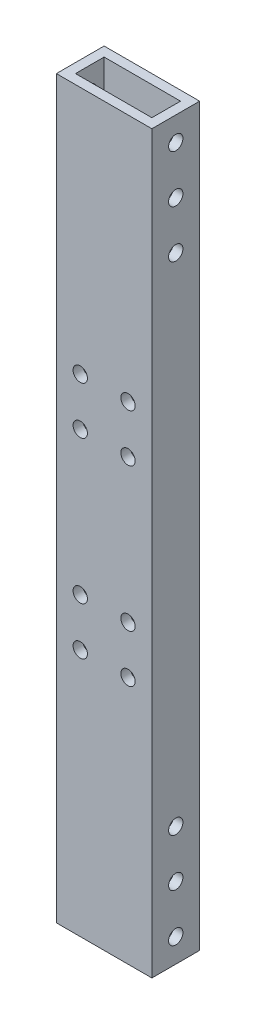
ISO-10303-21;
HEADER;
FILE_DESCRIPTION(('STEP AP214'),'2;1');
FILE_NAME('part.step','',(''),(''),'','','');
FILE_SCHEMA(('AUTOMOTIVE_DESIGN { 1 0 10303 214 1 1 1 1 }'));
ENDSEC;
DATA;
#1=APPLICATION_CONTEXT('core data for automotive mechanical design processes');
#2=APPLICATION_PROTOCOL_DEFINITION('international standard','automotive_design',2000,#1);
#3=PRODUCT_CONTEXT('',#1,'mechanical');
#4=PRODUCT('Part','Part','',(#3));
#5=PRODUCT_RELATED_PRODUCT_CATEGORY('part','',(#4));
#6=PRODUCT_DEFINITION_FORMATION('','',#4);
#7=PRODUCT_DEFINITION_CONTEXT('part definition',#1,'design');
#8=PRODUCT_DEFINITION('design','',#6,#7);
#9=PRODUCT_DEFINITION_SHAPE('','',#8);
#10=(LENGTH_UNIT() NAMED_UNIT(*) SI_UNIT(.MILLI.,.METRE.));
#11=(NAMED_UNIT(*) PLANE_ANGLE_UNIT() SI_UNIT($,.RADIAN.));
#12=(NAMED_UNIT(*) SI_UNIT($,.STERADIAN.) SOLID_ANGLE_UNIT());
#13=UNCERTAINTY_MEASURE_WITH_UNIT(LENGTH_MEASURE(1.E-05),#10,'distance_accuracy_value','');
#14=(GEOMETRIC_REPRESENTATION_CONTEXT(3) GLOBAL_UNCERTAINTY_ASSIGNED_CONTEXT((#13)) GLOBAL_UNIT_ASSIGNED_CONTEXT((#10,
#11,#12)) REPRESENTATION_CONTEXT('',''));
#15=CARTESIAN_POINT('',(0.,0.,0.));
#16=DIRECTION('',(0.,0.,1.));
#17=DIRECTION('',(1.,0.,0.));
#18=AXIS2_PLACEMENT_3D('',#15,#16,#17);
#19=CARTESIAN_POINT('',(0.,77.,0.));
#20=DIRECTION('',(0.,1.,0.));
#21=DIRECTION('',(0.,0.,1.));
#22=AXIS2_PLACEMENT_3D('',#19,#20,#21);
#23=PLANE('',#22);
#24=DIRECTION('',(0.,0.,-1.));
#25=VECTOR('',#24,1.);
#26=CARTESIAN_POINT('',(10.,77.,-5.));
#27=LINE('',#26,#25);
#28=CARTESIAN_POINT('',(10.,77.,5.));
#29=VERTEX_POINT('',#28);
#30=CARTESIAN_POINT('',(10.,77.,-5.));
#31=VERTEX_POINT('',#30);
#32=EDGE_CURVE('E140',#29,#31,#27,.T.);
#33=ORIENTED_EDGE('',*,*,#32,.T.);
#34=DIRECTION('',(-1.,0.,0.));
#35=VECTOR('',#34,1.);
#36=CARTESIAN_POINT('',(-10.,77.,-5.));
#37=LINE('',#36,#35);
#38=CARTESIAN_POINT('',(-10.,77.,-5.));
#39=VERTEX_POINT('',#38);
#40=EDGE_CURVE('E143',#31,#39,#37,.T.);
#41=ORIENTED_EDGE('',*,*,#40,.T.);
#42=DIRECTION('',(0.,0.,1.));
#43=VECTOR('',#42,1.);
#44=CARTESIAN_POINT('',(-10.,77.,-5.));
#45=LINE('',#44,#43);
#46=CARTESIAN_POINT('',(-10.,77.,5.));
#47=VERTEX_POINT('',#46);
#48=EDGE_CURVE('E146',#39,#47,#45,.T.);
#49=ORIENTED_EDGE('',*,*,#48,.T.);
#50=DIRECTION('',(1.,0.,0.));
#51=VECTOR('',#50,1.);
#52=CARTESIAN_POINT('',(-10.,77.,5.));
#53=LINE('',#52,#51);
#54=EDGE_CURVE('E148',#47,#29,#53,.T.);
#55=ORIENTED_EDGE('',*,*,#54,.T.);
#56=EDGE_LOOP('',(#33,#41,#49,#55));
#57=FACE_BOUND('',#56,.T.);
#58=DIRECTION('',(-1.,0.,0.));
#59=VECTOR('',#58,1.);
#60=CARTESIAN_POINT('',(-8.,77.,-3.));
#61=LINE('',#60,#59);
#62=CARTESIAN_POINT('',(8.,77.,-3.));
#63=VERTEX_POINT('',#62);
#64=CARTESIAN_POINT('',(-8.,77.,-3.));
#65=VERTEX_POINT('',#64);
#66=EDGE_CURVE('E110',#63,#65,#61,.T.);
#67=ORIENTED_EDGE('',*,*,#66,.F.);
#68=DIRECTION('',(0.,0.,-1.));
#69=VECTOR('',#68,1.);
#70=CARTESIAN_POINT('',(8.,77.,-3.));
#71=LINE('',#70,#69);
#72=CARTESIAN_POINT('',(8.,77.,3.));
#73=VERTEX_POINT('',#72);
#74=EDGE_CURVE('E102',#73,#63,#71,.T.);
#75=ORIENTED_EDGE('',*,*,#74,.F.);
#76=DIRECTION('',(1.,0.,0.));
#77=VECTOR('',#76,1.);
#78=CARTESIAN_POINT('',(-8.,77.,3.));
#79=LINE('',#78,#77);
#80=CARTESIAN_POINT('',(-8.,77.,3.));
#81=VERTEX_POINT('',#80);
#82=EDGE_CURVE('E124',#81,#73,#79,.T.);
#83=ORIENTED_EDGE('',*,*,#82,.F.);
#84=DIRECTION('',(0.,0.,1.));
#85=VECTOR('',#84,1.);
#86=CARTESIAN_POINT('',(-8.,77.,-3.));
#87=LINE('',#86,#85);
#88=EDGE_CURVE('E122',#65,#81,#87,.T.);
#89=ORIENTED_EDGE('',*,*,#88,.F.);
#90=EDGE_LOOP('',(#67,#75,#83,#89));
#91=FACE_BOUND('',#90,.T.);
#92=ADVANCED_FACE('F35',(#57,#91),#23,.T.);
#93=CARTESIAN_POINT('',(0.,-77.,0.));
#94=DIRECTION('',(0.,1.,0.));
#95=DIRECTION('',(0.,0.,1.));
#96=AXIS2_PLACEMENT_3D('',#93,#94,#95);
#97=PLANE('',#96);
#98=DIRECTION('',(0.,0.,-1.));
#99=VECTOR('',#98,1.);
#100=CARTESIAN_POINT('',(10.,-77.,-5.));
#101=LINE('',#100,#99);
#102=CARTESIAN_POINT('',(10.,-77.,5.));
#103=VERTEX_POINT('',#102);
#104=CARTESIAN_POINT('',(10.,-77.,-5.));
#105=VERTEX_POINT('',#104);
#106=EDGE_CURVE('E118',#103,#105,#101,.T.);
#107=ORIENTED_EDGE('',*,*,#106,.F.);
#108=DIRECTION('',(1.,0.,0.));
#109=VECTOR('',#108,1.);
#110=CARTESIAN_POINT('',(-10.,-77.,5.));
#111=LINE('',#110,#109);
#112=CARTESIAN_POINT('',(-10.,-77.,5.));
#113=VERTEX_POINT('',#112);
#114=EDGE_CURVE('E144',#113,#103,#111,.T.);
#115=ORIENTED_EDGE('',*,*,#114,.F.);
#116=DIRECTION('',(0.,0.,1.));
#117=VECTOR('',#116,1.);
#118=CARTESIAN_POINT('',(-10.,-77.,-5.));
#119=LINE('',#118,#117);
#120=CARTESIAN_POINT('',(-10.,-77.,-5.));
#121=VERTEX_POINT('',#120);
#122=EDGE_CURVE('E155',#121,#113,#119,.T.);
#123=ORIENTED_EDGE('',*,*,#122,.F.);
#124=DIRECTION('',(-1.,0.,0.));
#125=VECTOR('',#124,1.);
#126=CARTESIAN_POINT('',(-10.,-77.,-5.));
#127=LINE('',#126,#125);
#128=EDGE_CURVE('E153',#105,#121,#127,.T.);
#129=ORIENTED_EDGE('',*,*,#128,.F.);
#130=EDGE_LOOP('',(#107,#115,#123,#129));
#131=FACE_BOUND('',#130,.T.);
#132=DIRECTION('',(0.,0.,-1.));
#133=VECTOR('',#132,1.);
#134=CARTESIAN_POINT('',(8.,-77.,-3.));
#135=LINE('',#134,#133);
#136=CARTESIAN_POINT('',(8.,-77.,3.));
#137=VERTEX_POINT('',#136);
#138=CARTESIAN_POINT('',(8.,-77.,-3.));
#139=VERTEX_POINT('',#138);
#140=EDGE_CURVE('E60',#137,#139,#135,.T.);
#141=ORIENTED_EDGE('',*,*,#140,.T.);
#142=DIRECTION('',(-1.,0.,0.));
#143=VECTOR('',#142,1.);
#144=CARTESIAN_POINT('',(-8.,-77.,-3.));
#145=LINE('',#144,#143);
#146=CARTESIAN_POINT('',(-8.,-77.,-3.));
#147=VERTEX_POINT('',#146);
#148=EDGE_CURVE('E117',#139,#147,#145,.T.);
#149=ORIENTED_EDGE('',*,*,#148,.T.);
#150=DIRECTION('',(0.,0.,1.));
#151=VECTOR('',#150,1.);
#152=CARTESIAN_POINT('',(-8.,-77.,-3.));
#153=LINE('',#152,#151);
#154=CARTESIAN_POINT('',(-8.,-77.,3.));
#155=VERTEX_POINT('',#154);
#156=EDGE_CURVE('E132',#147,#155,#153,.T.);
#157=ORIENTED_EDGE('',*,*,#156,.T.);
#158=DIRECTION('',(1.,0.,0.));
#159=VECTOR('',#158,1.);
#160=CARTESIAN_POINT('',(-8.,-77.,3.));
#161=LINE('',#160,#159);
#162=EDGE_CURVE('E111',#155,#137,#161,.T.);
#163=ORIENTED_EDGE('',*,*,#162,.T.);
#164=EDGE_LOOP('',(#141,#149,#157,#163));
#165=FACE_BOUND('',#164,.T.);
#166=ADVANCED_FACE('F306',(#131,#165),#97,.F.);
#167=CARTESIAN_POINT('',(10.,77.,-5.));
#168=DIRECTION('',(-1.,0.,0.));
#169=DIRECTION('',(0.,0.,1.));
#170=AXIS2_PLACEMENT_3D('',#167,#168,#169);
#171=PLANE('',#170);
#172=CARTESIAN_POINT('',(10.,72.,0.));
#173=DIRECTION('',(1.,0.,0.));
#174=DIRECTION('',(0.,0.,-1.));
#175=AXIS2_PLACEMENT_3D('',#172,#173,#174);
#176=CIRCLE('',#175,1.5);
#177=CARTESIAN_POINT('',(10.,72.,-1.5));
#178=VERTEX_POINT('',#177);
#179=EDGE_CURVE('E241',#178,#178,#176,.T.);
#180=ORIENTED_EDGE('',*,*,#179,.F.);
#181=EDGE_LOOP('',(#180));
#182=FACE_BOUND('',#181,.T.);
#183=CARTESIAN_POINT('',(10.,62.0000000000001,0.));
#184=DIRECTION('',(1.,0.,0.));
#185=DIRECTION('',(0.,0.,-1.));
#186=AXIS2_PLACEMENT_3D('',#183,#184,#185);
#187=CIRCLE('',#186,1.5);
#188=CARTESIAN_POINT('',(10.,62.0000000000001,-1.5));
#189=VERTEX_POINT('',#188);
#190=EDGE_CURVE('E247',#189,#189,#187,.T.);
#191=ORIENTED_EDGE('',*,*,#190,.F.);
#192=EDGE_LOOP('',(#191));
#193=FACE_BOUND('',#192,.T.);
#194=CARTESIAN_POINT('',(10.,-72.,0.));
#195=DIRECTION('',(1.,0.,0.));
#196=DIRECTION('',(0.,0.,1.));
#197=AXIS2_PLACEMENT_3D('',#194,#195,#196);
#198=CIRCLE('',#197,1.5);
#199=CARTESIAN_POINT('',(10.,-72.,1.5));
#200=VERTEX_POINT('',#199);
#201=EDGE_CURVE('E253',#200,#200,#198,.T.);
#202=ORIENTED_EDGE('',*,*,#201,.F.);
#203=EDGE_LOOP('',(#202));
#204=FACE_BOUND('',#203,.T.);
#205=CARTESIAN_POINT('',(10.,-62.0000000000001,0.));
#206=DIRECTION('',(1.,0.,0.));
#207=DIRECTION('',(0.,0.,1.));
#208=AXIS2_PLACEMENT_3D('',#205,#206,#207);
#209=CIRCLE('',#208,1.5);
#210=CARTESIAN_POINT('',(10.,-62.0000000000001,1.5));
#211=VERTEX_POINT('',#210);
#212=EDGE_CURVE('E234',#211,#211,#209,.T.);
#213=ORIENTED_EDGE('',*,*,#212,.F.);
#214=EDGE_LOOP('',(#213));
#215=FACE_BOUND('',#214,.T.);
#216=CARTESIAN_POINT('',(10.,-52.0000000000003,0.));
#217=DIRECTION('',(1.,0.,0.));
#218=DIRECTION('',(0.,0.,1.));
#219=AXIS2_PLACEMENT_3D('',#216,#217,#218);
#220=CIRCLE('',#219,1.5);
#221=CARTESIAN_POINT('',(10.,-52.0000000000003,1.5));
#222=VERTEX_POINT('',#221);
#223=EDGE_CURVE('E230',#222,#222,#220,.T.);
#224=ORIENTED_EDGE('',*,*,#223,.F.);
#225=EDGE_LOOP('',(#224));
#226=FACE_BOUND('',#225,.T.);
#227=CARTESIAN_POINT('',(10.,52.0000000000003,0.));
#228=DIRECTION('',(1.,0.,0.));
#229=DIRECTION('',(0.,0.,-1.));
#230=AXIS2_PLACEMENT_3D('',#227,#228,#229);
#231=CIRCLE('',#230,1.5);
#232=CARTESIAN_POINT('',(10.,52.0000000000003,-1.5));
#233=VERTEX_POINT('',#232);
#234=EDGE_CURVE('E240',#233,#233,#231,.T.);
#235=ORIENTED_EDGE('',*,*,#234,.F.);
#236=EDGE_LOOP('',(#235));
#237=FACE_BOUND('',#236,.T.);
#238=ORIENTED_EDGE('',*,*,#106,.T.);
#239=DIRECTION('',(0.,-1.,0.));
#240=VECTOR('',#239,1.);
#241=CARTESIAN_POINT('',(10.,77.,-5.));
#242=LINE('',#241,#240);
#243=EDGE_CURVE('E11',#31,#105,#242,.T.);
#244=ORIENTED_EDGE('',*,*,#243,.F.);
#245=ORIENTED_EDGE('',*,*,#32,.F.);
#246=DIRECTION('',(0.,-1.,0.));
#247=VECTOR('',#246,1.);
#248=CARTESIAN_POINT('',(10.,77.,5.));
#249=LINE('',#248,#247);
#250=EDGE_CURVE('E150',#29,#103,#249,.T.);
#251=ORIENTED_EDGE('',*,*,#250,.T.);
#252=EDGE_LOOP('',(#238,#244,#245,#251));
#253=FACE_BOUND('',#252,.T.);
#254=ADVANCED_FACE('F37',(#182,#193,#204,#215,#226,#237,#253),#171,.F.);
#255=CARTESIAN_POINT('',(-10.,77.,-5.));
#256=DIRECTION('',(0.,0.,1.));
#257=DIRECTION('',(1.,0.,0.));
#258=AXIS2_PLACEMENT_3D('',#255,#256,#257);
#259=PLANE('',#258);
#260=CARTESIAN_POINT('',(5.00000000000161,25.000000000001,-5.));
#261=DIRECTION('',(0.,0.,-1.));
#262=DIRECTION('',(1.,0.,0.));
#263=AXIS2_PLACEMENT_3D('',#260,#261,#262);
#264=CIRCLE('',#263,1.5);
#265=CARTESIAN_POINT('',(6.5000000000016,25.000000000001,-5.));
#266=VERTEX_POINT('',#265);
#267=EDGE_CURVE('E438',#266,#266,#264,.T.);
#268=ORIENTED_EDGE('',*,*,#267,.F.);
#269=EDGE_LOOP('',(#268));
#270=FACE_BOUND('',#269,.T.);
#271=CARTESIAN_POINT('',(-4.99999999999841,-25.000000000001,-5.));
#272=DIRECTION('',(0.,0.,-1.));
#273=DIRECTION('',(-1.,0.,0.));
#274=AXIS2_PLACEMENT_3D('',#271,#272,#273);
#275=CIRCLE('',#274,1.5);
#276=CARTESIAN_POINT('',(-6.49999999999841,-25.000000000001,-5.));
#277=VERTEX_POINT('',#276);
#278=EDGE_CURVE('E456',#277,#277,#275,.T.);
#279=ORIENTED_EDGE('',*,*,#278,.F.);
#280=EDGE_LOOP('',(#279));
#281=FACE_BOUND('',#280,.T.);
#282=CARTESIAN_POINT('',(5.0000000000016,-25.000000000001,-5.));
#283=DIRECTION('',(0.,0.,-1.));
#284=DIRECTION('',(-1.,0.,0.));
#285=AXIS2_PLACEMENT_3D('',#282,#283,#284);
#286=CIRCLE('',#285,1.5);
#287=CARTESIAN_POINT('',(3.5000000000016,-25.000000000001,-5.));
#288=VERTEX_POINT('',#287);
#289=EDGE_CURVE('E455',#288,#288,#286,.T.);
#290=ORIENTED_EDGE('',*,*,#289,.F.);
#291=EDGE_LOOP('',(#290));
#292=FACE_BOUND('',#291,.T.);
#293=CARTESIAN_POINT('',(5.00000000000161,-15.000000000001,-5.));
#294=DIRECTION('',(0.,0.,-1.));
#295=DIRECTION('',(-1.,0.,0.));
#296=AXIS2_PLACEMENT_3D('',#293,#294,#295);
#297=CIRCLE('',#296,1.5);
#298=CARTESIAN_POINT('',(3.50000000000161,-15.000000000001,-5.));
#299=VERTEX_POINT('',#298);
#300=EDGE_CURVE('E468',#299,#299,#297,.T.);
#301=ORIENTED_EDGE('',*,*,#300,.F.);
#302=EDGE_LOOP('',(#301));
#303=FACE_BOUND('',#302,.T.);
#304=CARTESIAN_POINT('',(-4.9999999999984,25.000000000001,-5.));
#305=DIRECTION('',(0.,0.,-1.));
#306=DIRECTION('',(1.,0.,0.));
#307=AXIS2_PLACEMENT_3D('',#304,#305,#306);
#308=CIRCLE('',#307,1.5);
#309=CARTESIAN_POINT('',(-3.4999999999984,25.000000000001,-5.));
#310=VERTEX_POINT('',#309);
#311=EDGE_CURVE('E432',#310,#310,#308,.T.);
#312=ORIENTED_EDGE('',*,*,#311,.F.);
#313=EDGE_LOOP('',(#312));
#314=FACE_BOUND('',#313,.T.);
#315=CARTESIAN_POINT('',(-4.9999999999984,15.000000000001,-5.));
#316=DIRECTION('',(0.,0.,-1.));
#317=DIRECTION('',(1.,0.,0.));
#318=AXIS2_PLACEMENT_3D('',#315,#316,#317);
#319=CIRCLE('',#318,1.5);
#320=CARTESIAN_POINT('',(-3.4999999999984,15.000000000001,-5.));
#321=VERTEX_POINT('',#320);
#322=EDGE_CURVE('E441',#321,#321,#319,.T.);
#323=ORIENTED_EDGE('',*,*,#322,.F.);
#324=EDGE_LOOP('',(#323));
#325=FACE_BOUND('',#324,.T.);
#326=CARTESIAN_POINT('',(5.00000000000161,15.000000000001,-5.));
#327=DIRECTION('',(0.,0.,-1.));
#328=DIRECTION('',(1.,0.,0.));
#329=AXIS2_PLACEMENT_3D('',#326,#327,#328);
#330=CIRCLE('',#329,1.5);
#331=CARTESIAN_POINT('',(6.50000000000161,15.000000000001,-5.));
#332=VERTEX_POINT('',#331);
#333=EDGE_CURVE('E449',#332,#332,#330,.T.);
#334=ORIENTED_EDGE('',*,*,#333,.F.);
#335=EDGE_LOOP('',(#334));
#336=FACE_BOUND('',#335,.T.);
#337=CARTESIAN_POINT('',(-4.9999999999984,-15.000000000001,-5.));
#338=DIRECTION('',(0.,0.,-1.));
#339=DIRECTION('',(-1.,0.,0.));
#340=AXIS2_PLACEMENT_3D('',#337,#338,#339);
#341=CIRCLE('',#340,1.5);
#342=CARTESIAN_POINT('',(-6.4999999999984,-15.000000000001,-5.));
#343=VERTEX_POINT('',#342);
#344=EDGE_CURVE('E467',#343,#343,#341,.T.);
#345=ORIENTED_EDGE('',*,*,#344,.F.);
#346=EDGE_LOOP('',(#345));
#347=FACE_BOUND('',#346,.T.);
#348=ORIENTED_EDGE('',*,*,#128,.T.);
#349=DIRECTION('',(0.,-1.,0.));
#350=VECTOR('',#349,1.);
#351=CARTESIAN_POINT('',(-10.,77.,-5.));
#352=LINE('',#351,#350);
#353=EDGE_CURVE('E44',#39,#121,#352,.T.);
#354=ORIENTED_EDGE('',*,*,#353,.F.);
#355=ORIENTED_EDGE('',*,*,#40,.F.);
#356=ORIENTED_EDGE('',*,*,#243,.T.);
#357=EDGE_LOOP('',(#348,#354,#355,#356));
#358=FACE_BOUND('',#357,.T.);
#359=ADVANCED_FACE('F305',(#270,#281,#292,#303,#314,#325,#336,#347,#358),#259,.F.);
#360=CARTESIAN_POINT('',(-10.,77.,-5.));
#361=DIRECTION('',(1.,0.,0.));
#362=DIRECTION('',(0.,0.,-1.));
#363=AXIS2_PLACEMENT_3D('',#360,#361,#362);
#364=PLANE('',#363);
#365=CARTESIAN_POINT('',(-10.,72.,0.));
#366=DIRECTION('',(1.,0.,0.));
#367=DIRECTION('',(0.,0.,-1.));
#368=AXIS2_PLACEMENT_3D('',#365,#366,#367);
#369=CIRCLE('',#368,1.5);
#370=CARTESIAN_POINT('',(-10.,72.,-1.49999999999999));
#371=VERTEX_POINT('',#370);
#372=EDGE_CURVE('E237',#371,#371,#369,.T.);
#373=ORIENTED_EDGE('',*,*,#372,.T.);
#374=EDGE_LOOP('',(#373));
#375=FACE_BOUND('',#374,.T.);
#376=CARTESIAN_POINT('',(-10.,62.0000000000001,0.));
#377=DIRECTION('',(1.,0.,0.));
#378=DIRECTION('',(0.,0.,-1.));
#379=AXIS2_PLACEMENT_3D('',#376,#377,#378);
#380=CIRCLE('',#379,1.5);
#381=CARTESIAN_POINT('',(-10.,62.0000000000001,-1.49999999999999));
#382=VERTEX_POINT('',#381);
#383=EDGE_CURVE('E244',#382,#382,#380,.T.);
#384=ORIENTED_EDGE('',*,*,#383,.T.);
#385=EDGE_LOOP('',(#384));
#386=FACE_BOUND('',#385,.T.);
#387=CARTESIAN_POINT('',(-10.,-72.,0.));
#388=DIRECTION('',(1.,0.,0.));
#389=DIRECTION('',(0.,0.,1.));
#390=AXIS2_PLACEMENT_3D('',#387,#388,#389);
#391=CIRCLE('',#390,1.5);
#392=CARTESIAN_POINT('',(-10.,-72.,1.50000000000001));
#393=VERTEX_POINT('',#392);
#394=EDGE_CURVE('E250',#393,#393,#391,.T.);
#395=ORIENTED_EDGE('',*,*,#394,.T.);
#396=EDGE_LOOP('',(#395));
#397=FACE_BOUND('',#396,.T.);
#398=CARTESIAN_POINT('',(-10.,-62.0000000000001,0.));
#399=DIRECTION('',(1.,0.,0.));
#400=DIRECTION('',(0.,0.,1.));
#401=AXIS2_PLACEMENT_3D('',#398,#399,#400);
#402=CIRCLE('',#401,1.5);
#403=CARTESIAN_POINT('',(-10.,-62.0000000000001,1.50000000000001));
#404=VERTEX_POINT('',#403);
#405=EDGE_CURVE('E256',#404,#404,#402,.T.);
#406=ORIENTED_EDGE('',*,*,#405,.T.);
#407=EDGE_LOOP('',(#406));
#408=FACE_BOUND('',#407,.T.);
#409=CARTESIAN_POINT('',(-10.,-52.0000000000003,0.));
#410=DIRECTION('',(1.,0.,0.));
#411=DIRECTION('',(0.,0.,1.));
#412=AXIS2_PLACEMENT_3D('',#409,#410,#411);
#413=CIRCLE('',#412,1.5);
#414=CARTESIAN_POINT('',(-10.,-52.0000000000003,1.5));
#415=VERTEX_POINT('',#414);
#416=EDGE_CURVE('E231',#415,#415,#413,.T.);
#417=ORIENTED_EDGE('',*,*,#416,.T.);
#418=EDGE_LOOP('',(#417));
#419=FACE_BOUND('',#418,.T.);
#420=CARTESIAN_POINT('',(-10.,52.0000000000003,0.));
#421=DIRECTION('',(1.,0.,0.));
#422=DIRECTION('',(0.,0.,-1.));
#423=AXIS2_PLACEMENT_3D('',#420,#421,#422);
#424=CIRCLE('',#423,1.5);
#425=CARTESIAN_POINT('',(-10.,52.0000000000003,-1.5));
#426=VERTEX_POINT('',#425);
#427=EDGE_CURVE('E169',#426,#426,#424,.T.);
#428=ORIENTED_EDGE('',*,*,#427,.T.);
#429=EDGE_LOOP('',(#428));
#430=FACE_BOUND('',#429,.T.);
#431=ORIENTED_EDGE('',*,*,#122,.T.);
#432=DIRECTION('',(0.,-1.,0.));
#433=VECTOR('',#432,1.);
#434=CARTESIAN_POINT('',(-10.,77.,5.));
#435=LINE('',#434,#433);
#436=EDGE_CURVE('E160',#47,#113,#435,.T.);
#437=ORIENTED_EDGE('',*,*,#436,.F.);
#438=ORIENTED_EDGE('',*,*,#48,.F.);
#439=ORIENTED_EDGE('',*,*,#353,.T.);
#440=EDGE_LOOP('',(#431,#437,#438,#439));
#441=FACE_BOUND('',#440,.T.);
#442=ADVANCED_FACE('F324',(#375,#386,#397,#408,#419,#430,#441),#364,.F.);
#443=CARTESIAN_POINT('',(-10.,77.,5.));
#444=DIRECTION('',(0.,0.,-1.));
#445=DIRECTION('',(-1.,0.,0.));
#446=AXIS2_PLACEMENT_3D('',#443,#444,#445);
#447=PLANE('',#446);
#448=CARTESIAN_POINT('',(5.00000000000161,25.000000000001,5.));
#449=DIRECTION('',(0.,0.,-1.));
#450=DIRECTION('',(1.,0.,0.));
#451=AXIS2_PLACEMENT_3D('',#448,#449,#450);
#452=CIRCLE('',#451,1.5);
#453=CARTESIAN_POINT('',(6.5000000000016,25.000000000001,5.));
#454=VERTEX_POINT('',#453);
#455=EDGE_CURVE('E459',#454,#454,#452,.T.);
#456=ORIENTED_EDGE('',*,*,#455,.T.);
#457=EDGE_LOOP('',(#456));
#458=FACE_BOUND('',#457,.T.);
#459=CARTESIAN_POINT('',(-4.99999999999841,-25.000000000001,5.));
#460=DIRECTION('',(0.,0.,-1.));
#461=DIRECTION('',(-1.,0.,0.));
#462=AXIS2_PLACEMENT_3D('',#459,#460,#461);
#463=CIRCLE('',#462,1.5);
#464=CARTESIAN_POINT('',(-6.49999999999841,-25.000000000001,5.));
#465=VERTEX_POINT('',#464);
#466=EDGE_CURVE('E452',#465,#465,#463,.T.);
#467=ORIENTED_EDGE('',*,*,#466,.T.);
#468=EDGE_LOOP('',(#467));
#469=FACE_BOUND('',#468,.T.);
#470=CARTESIAN_POINT('',(5.0000000000016,-25.000000000001,5.));
#471=DIRECTION('',(0.,0.,-1.));
#472=DIRECTION('',(-1.,0.,0.));
#473=AXIS2_PLACEMENT_3D('',#470,#471,#472);
#474=CIRCLE('',#473,1.5);
#475=CARTESIAN_POINT('',(3.5000000000016,-25.000000000001,5.));
#476=VERTEX_POINT('',#475);
#477=EDGE_CURVE('E471',#476,#476,#474,.T.);
#478=ORIENTED_EDGE('',*,*,#477,.T.);
#479=EDGE_LOOP('',(#478));
#480=FACE_BOUND('',#479,.T.);
#481=CARTESIAN_POINT('',(5.00000000000161,-15.000000000001,5.));
#482=DIRECTION('',(0.,0.,-1.));
#483=DIRECTION('',(-1.,0.,0.));
#484=AXIS2_PLACEMENT_3D('',#481,#482,#483);
#485=CIRCLE('',#484,1.5);
#486=CARTESIAN_POINT('',(3.50000000000161,-15.000000000001,5.));
#487=VERTEX_POINT('',#486);
#488=EDGE_CURVE('E464',#487,#487,#485,.T.);
#489=ORIENTED_EDGE('',*,*,#488,.T.);
#490=EDGE_LOOP('',(#489));
#491=FACE_BOUND('',#490,.T.);
#492=CARTESIAN_POINT('',(-4.9999999999984,25.000000000001,5.));
#493=DIRECTION('',(0.,0.,-1.));
#494=DIRECTION('',(1.,0.,0.));
#495=AXIS2_PLACEMENT_3D('',#492,#493,#494);
#496=CIRCLE('',#495,1.5);
#497=CARTESIAN_POINT('',(-3.4999999999984,25.000000000001,5.));
#498=VERTEX_POINT('',#497);
#499=EDGE_CURVE('E434',#498,#498,#496,.T.);
#500=ORIENTED_EDGE('',*,*,#499,.T.);
#501=EDGE_LOOP('',(#500));
#502=FACE_BOUND('',#501,.T.);
#503=CARTESIAN_POINT('',(-4.9999999999984,15.000000000001,5.));
#504=DIRECTION('',(0.,0.,-1.));
#505=DIRECTION('',(1.,0.,0.));
#506=AXIS2_PLACEMENT_3D('',#503,#504,#505);
#507=CIRCLE('',#506,1.5);
#508=CARTESIAN_POINT('',(-3.4999999999984,15.000000000001,5.));
#509=VERTEX_POINT('',#508);
#510=EDGE_CURVE('E435',#509,#509,#507,.T.);
#511=ORIENTED_EDGE('',*,*,#510,.T.);
#512=EDGE_LOOP('',(#511));
#513=FACE_BOUND('',#512,.T.);
#514=CARTESIAN_POINT('',(5.00000000000161,15.000000000001,5.));
#515=DIRECTION('',(0.,0.,-1.));
#516=DIRECTION('',(1.,0.,0.));
#517=AXIS2_PLACEMENT_3D('',#514,#515,#516);
#518=CIRCLE('',#517,1.5);
#519=CARTESIAN_POINT('',(6.50000000000161,15.000000000001,5.));
#520=VERTEX_POINT('',#519);
#521=EDGE_CURVE('E446',#520,#520,#518,.T.);
#522=ORIENTED_EDGE('',*,*,#521,.T.);
#523=EDGE_LOOP('',(#522));
#524=FACE_BOUND('',#523,.T.);
#525=CARTESIAN_POINT('',(-4.9999999999984,-15.000000000001,5.));
#526=DIRECTION('',(0.,0.,-1.));
#527=DIRECTION('',(-1.,0.,0.));
#528=AXIS2_PLACEMENT_3D('',#525,#526,#527);
#529=CIRCLE('',#528,1.5);
#530=CARTESIAN_POINT('',(-6.4999999999984,-15.000000000001,5.));
#531=VERTEX_POINT('',#530);
#532=EDGE_CURVE('E193',#531,#531,#529,.T.);
#533=ORIENTED_EDGE('',*,*,#532,.T.);
#534=EDGE_LOOP('',(#533));
#535=FACE_BOUND('',#534,.T.);
#536=ORIENTED_EDGE('',*,*,#114,.T.);
#537=ORIENTED_EDGE('',*,*,#250,.F.);
#538=ORIENTED_EDGE('',*,*,#54,.F.);
#539=ORIENTED_EDGE('',*,*,#436,.T.);
#540=EDGE_LOOP('',(#536,#537,#538,#539));
#541=FACE_BOUND('',#540,.T.);
#542=ADVANCED_FACE('F282',(#458,#469,#480,#491,#502,#513,#524,#535,#541),#447,.F.);
#543=CARTESIAN_POINT('',(8.,77.,-3.));
#544=DIRECTION('',(-1.,0.,0.));
#545=DIRECTION('',(0.,0.,1.));
#546=AXIS2_PLACEMENT_3D('',#543,#544,#545);
#547=PLANE('',#546);
#548=CARTESIAN_POINT('',(8.,72.,0.));
#549=DIRECTION('',(-1.,0.,0.));
#550=DIRECTION('',(0.,0.,1.));
#551=AXIS2_PLACEMENT_3D('',#548,#549,#550);
#552=CIRCLE('',#551,1.5);
#553=CARTESIAN_POINT('',(8.,72.,1.5));
#554=VERTEX_POINT('',#553);
#555=EDGE_CURVE('E130',#554,#554,#552,.T.);
#556=ORIENTED_EDGE('',*,*,#555,.F.);
#557=EDGE_LOOP('',(#556));
#558=FACE_BOUND('',#557,.T.);
#559=CARTESIAN_POINT('',(8.,62.0000000000001,0.));
#560=DIRECTION('',(-1.,0.,0.));
#561=DIRECTION('',(0.,0.,1.));
#562=AXIS2_PLACEMENT_3D('',#559,#560,#561);
#563=CIRCLE('',#562,1.5);
#564=CARTESIAN_POINT('',(8.,62.0000000000001,1.5));
#565=VERTEX_POINT('',#564);
#566=EDGE_CURVE('E185',#565,#565,#563,.T.);
#567=ORIENTED_EDGE('',*,*,#566,.F.);
#568=EDGE_LOOP('',(#567));
#569=FACE_BOUND('',#568,.T.);
#570=CARTESIAN_POINT('',(8.,-72.,0.));
#571=DIRECTION('',(-1.,0.,0.));
#572=DIRECTION('',(0.,0.,1.));
#573=AXIS2_PLACEMENT_3D('',#570,#571,#572);
#574=CIRCLE('',#573,1.5);
#575=CARTESIAN_POINT('',(8.,-72.,1.5));
#576=VERTEX_POINT('',#575);
#577=EDGE_CURVE('E181',#576,#576,#574,.T.);
#578=ORIENTED_EDGE('',*,*,#577,.F.);
#579=EDGE_LOOP('',(#578));
#580=FACE_BOUND('',#579,.T.);
#581=CARTESIAN_POINT('',(8.,-62.0000000000001,0.));
#582=DIRECTION('',(-1.,0.,0.));
#583=DIRECTION('',(0.,0.,1.));
#584=AXIS2_PLACEMENT_3D('',#581,#582,#583);
#585=CIRCLE('',#584,1.5);
#586=CARTESIAN_POINT('',(8.,-62.0000000000001,1.5));
#587=VERTEX_POINT('',#586);
#588=EDGE_CURVE('E177',#587,#587,#585,.T.);
#589=ORIENTED_EDGE('',*,*,#588,.F.);
#590=EDGE_LOOP('',(#589));
#591=FACE_BOUND('',#590,.T.);
#592=CARTESIAN_POINT('',(8.,-52.0000000000003,0.));
#593=DIRECTION('',(-1.,0.,0.));
#594=DIRECTION('',(0.,0.,1.));
#595=AXIS2_PLACEMENT_3D('',#592,#593,#594);
#596=CIRCLE('',#595,1.5);
#597=CARTESIAN_POINT('',(8.,-52.0000000000003,1.5));
#598=VERTEX_POINT('',#597);
#599=EDGE_CURVE('E173',#598,#598,#596,.T.);
#600=ORIENTED_EDGE('',*,*,#599,.F.);
#601=EDGE_LOOP('',(#600));
#602=FACE_BOUND('',#601,.T.);
#603=CARTESIAN_POINT('',(8.,52.0000000000003,0.));
#604=DIRECTION('',(-1.,0.,0.));
#605=DIRECTION('',(0.,0.,1.));
#606=AXIS2_PLACEMENT_3D('',#603,#604,#605);
#607=CIRCLE('',#606,1.5);
#608=CARTESIAN_POINT('',(8.,52.0000000000003,1.5));
#609=VERTEX_POINT('',#608);
#610=EDGE_CURVE('E168',#609,#609,#607,.T.);
#611=ORIENTED_EDGE('',*,*,#610,.F.);
#612=EDGE_LOOP('',(#611));
#613=FACE_BOUND('',#612,.T.);
#614=ORIENTED_EDGE('',*,*,#140,.F.);
#615=DIRECTION('',(0.,-1.,0.));
#616=VECTOR('',#615,1.);
#617=CARTESIAN_POINT('',(8.,77.,3.));
#618=LINE('',#617,#616);
#619=EDGE_CURVE('E106',#73,#137,#618,.T.);
#620=ORIENTED_EDGE('',*,*,#619,.F.);
#621=ORIENTED_EDGE('',*,*,#74,.T.);
#622=DIRECTION('',(0.,-1.,0.));
#623=VECTOR('',#622,1.);
#624=CARTESIAN_POINT('',(8.,77.,-3.));
#625=LINE('',#624,#623);
#626=EDGE_CURVE('E105',#63,#139,#625,.T.);
#627=ORIENTED_EDGE('',*,*,#626,.T.);
#628=EDGE_LOOP('',(#614,#620,#621,#627));
#629=FACE_BOUND('',#628,.T.);
#630=ADVANCED_FACE('F104',(#558,#569,#580,#591,#602,#613,#629),#547,.T.);
#631=CARTESIAN_POINT('',(-8.,77.,-3.));
#632=DIRECTION('',(0.,0.,1.));
#633=DIRECTION('',(1.,0.,0.));
#634=AXIS2_PLACEMENT_3D('',#631,#632,#633);
#635=PLANE('',#634);
#636=CARTESIAN_POINT('',(5.00000000000161,25.000000000001,-3.));
#637=DIRECTION('',(0.,0.,1.));
#638=DIRECTION('',(1.,0.,0.));
#639=AXIS2_PLACEMENT_3D('',#636,#637,#638);
#640=CIRCLE('',#639,1.5);
#641=CARTESIAN_POINT('',(6.5000000000016,25.000000000001,-3.));
#642=VERTEX_POINT('',#641);
#643=EDGE_CURVE('E227',#642,#642,#640,.T.);
#644=ORIENTED_EDGE('',*,*,#643,.F.);
#645=EDGE_LOOP('',(#644));
#646=FACE_BOUND('',#645,.T.);
#647=CARTESIAN_POINT('',(-4.99999999999841,-25.000000000001,-3.));
#648=DIRECTION('',(0.,0.,1.));
#649=DIRECTION('',(1.,0.,0.));
#650=AXIS2_PLACEMENT_3D('',#647,#648,#649);
#651=CIRCLE('',#650,1.5);
#652=CARTESIAN_POINT('',(-3.49999999999841,-25.000000000001,-3.));
#653=VERTEX_POINT('',#652);
#654=EDGE_CURVE('E215',#653,#653,#651,.T.);
#655=ORIENTED_EDGE('',*,*,#654,.F.);
#656=EDGE_LOOP('',(#655));
#657=FACE_BOUND('',#656,.T.);
#658=CARTESIAN_POINT('',(5.0000000000016,-25.000000000001,-3.));
#659=DIRECTION('',(0.,0.,1.));
#660=DIRECTION('',(1.,0.,0.));
#661=AXIS2_PLACEMENT_3D('',#658,#659,#660);
#662=CIRCLE('',#661,1.5);
#663=CARTESIAN_POINT('',(6.5000000000016,-25.000000000001,-3.));
#664=VERTEX_POINT('',#663);
#665=EDGE_CURVE('E212',#664,#664,#662,.T.);
#666=ORIENTED_EDGE('',*,*,#665,.F.);
#667=EDGE_LOOP('',(#666));
#668=FACE_BOUND('',#667,.T.);
#669=CARTESIAN_POINT('',(5.00000000000161,-15.000000000001,-3.));
#670=DIRECTION('',(0.,0.,1.));
#671=DIRECTION('',(1.,0.,0.));
#672=AXIS2_PLACEMENT_3D('',#669,#670,#671);
#673=CIRCLE('',#672,1.5);
#674=CARTESIAN_POINT('',(6.50000000000161,-15.000000000001,-3.));
#675=VERTEX_POINT('',#674);
#676=EDGE_CURVE('E209',#675,#675,#673,.T.);
#677=ORIENTED_EDGE('',*,*,#676,.F.);
#678=EDGE_LOOP('',(#677));
#679=FACE_BOUND('',#678,.T.);
#680=CARTESIAN_POINT('',(-4.9999999999984,25.000000000001,-3.));
#681=DIRECTION('',(0.,0.,1.));
#682=DIRECTION('',(1.,0.,0.));
#683=AXIS2_PLACEMENT_3D('',#680,#681,#682);
#684=CIRCLE('',#683,1.5);
#685=CARTESIAN_POINT('',(-3.4999999999984,25.000000000001,-3.));
#686=VERTEX_POINT('',#685);
#687=EDGE_CURVE('E205',#686,#686,#684,.T.);
#688=ORIENTED_EDGE('',*,*,#687,.F.);
#689=EDGE_LOOP('',(#688));
#690=FACE_BOUND('',#689,.T.);
#691=CARTESIAN_POINT('',(-4.9999999999984,15.000000000001,-3.));
#692=DIRECTION('',(0.,0.,1.));
#693=DIRECTION('',(1.,0.,0.));
#694=AXIS2_PLACEMENT_3D('',#691,#692,#693);
#695=CIRCLE('',#694,1.5);
#696=CARTESIAN_POINT('',(-3.4999999999984,15.000000000001,-3.));
#697=VERTEX_POINT('',#696);
#698=EDGE_CURVE('E201',#697,#697,#695,.T.);
#699=ORIENTED_EDGE('',*,*,#698,.F.);
#700=EDGE_LOOP('',(#699));
#701=FACE_BOUND('',#700,.T.);
#702=CARTESIAN_POINT('',(5.00000000000161,15.000000000001,-3.));
#703=DIRECTION('',(0.,0.,1.));
#704=DIRECTION('',(1.,0.,0.));
#705=AXIS2_PLACEMENT_3D('',#702,#703,#704);
#706=CIRCLE('',#705,1.5);
#707=CARTESIAN_POINT('',(6.50000000000161,15.000000000001,-3.));
#708=VERTEX_POINT('',#707);
#709=EDGE_CURVE('E197',#708,#708,#706,.T.);
#710=ORIENTED_EDGE('',*,*,#709,.F.);
#711=EDGE_LOOP('',(#710));
#712=FACE_BOUND('',#711,.T.);
#713=CARTESIAN_POINT('',(-4.9999999999984,-15.000000000001,-3.));
#714=DIRECTION('',(0.,0.,1.));
#715=DIRECTION('',(1.,0.,0.));
#716=AXIS2_PLACEMENT_3D('',#713,#714,#715);
#717=CIRCLE('',#716,1.5);
#718=CARTESIAN_POINT('',(-3.4999999999984,-15.000000000001,-3.));
#719=VERTEX_POINT('',#718);
#720=EDGE_CURVE('E192',#719,#719,#717,.T.);
#721=ORIENTED_EDGE('',*,*,#720,.F.);
#722=EDGE_LOOP('',(#721));
#723=FACE_BOUND('',#722,.T.);
#724=ORIENTED_EDGE('',*,*,#148,.F.);
#725=ORIENTED_EDGE('',*,*,#626,.F.);
#726=ORIENTED_EDGE('',*,*,#66,.T.);
#727=DIRECTION('',(0.,-1.,0.));
#728=VECTOR('',#727,1.);
#729=CARTESIAN_POINT('',(-8.,77.,-3.));
#730=LINE('',#729,#728);
#731=EDGE_CURVE('E119',#65,#147,#730,.T.);
#732=ORIENTED_EDGE('',*,*,#731,.T.);
#733=EDGE_LOOP('',(#724,#725,#726,#732));
#734=FACE_BOUND('',#733,.T.);
#735=ADVANCED_FACE('F114',(#646,#657,#668,#679,#690,#701,#712,#723,#734),#635,.T.);
#736=CARTESIAN_POINT('',(-8.,77.,-3.));
#737=DIRECTION('',(1.,0.,0.));
#738=DIRECTION('',(0.,0.,-1.));
#739=AXIS2_PLACEMENT_3D('',#736,#737,#738);
#740=PLANE('',#739);
#741=CARTESIAN_POINT('',(-8.,72.,0.));
#742=DIRECTION('',(1.,0.,0.));
#743=DIRECTION('',(0.,0.,-1.));
#744=AXIS2_PLACEMENT_3D('',#741,#742,#743);
#745=CIRCLE('',#744,1.5);
#746=CARTESIAN_POINT('',(-8.,72.,-1.49999999999999));
#747=VERTEX_POINT('',#746);
#748=EDGE_CURVE('E186',#747,#747,#745,.T.);
#749=ORIENTED_EDGE('',*,*,#748,.F.);
#750=EDGE_LOOP('',(#749));
#751=FACE_BOUND('',#750,.T.);
#752=CARTESIAN_POINT('',(-8.,62.0000000000001,0.));
#753=DIRECTION('',(1.,0.,0.));
#754=DIRECTION('',(0.,0.,-1.));
#755=AXIS2_PLACEMENT_3D('',#752,#753,#754);
#756=CIRCLE('',#755,1.5);
#757=CARTESIAN_POINT('',(-8.,62.0000000000001,-1.49999999999999));
#758=VERTEX_POINT('',#757);
#759=EDGE_CURVE('E182',#758,#758,#756,.T.);
#760=ORIENTED_EDGE('',*,*,#759,.F.);
#761=EDGE_LOOP('',(#760));
#762=FACE_BOUND('',#761,.T.);
#763=CARTESIAN_POINT('',(-8.,-72.,0.));
#764=DIRECTION('',(1.,0.,0.));
#765=DIRECTION('',(0.,0.,-1.));
#766=AXIS2_PLACEMENT_3D('',#763,#764,#765);
#767=CIRCLE('',#766,1.5);
#768=CARTESIAN_POINT('',(-8.,-72.,-1.49999999999999));
#769=VERTEX_POINT('',#768);
#770=EDGE_CURVE('E178',#769,#769,#767,.T.);
#771=ORIENTED_EDGE('',*,*,#770,.F.);
#772=EDGE_LOOP('',(#771));
#773=FACE_BOUND('',#772,.T.);
#774=CARTESIAN_POINT('',(-8.,-62.0000000000001,0.));
#775=DIRECTION('',(1.,0.,0.));
#776=DIRECTION('',(0.,0.,-1.));
#777=AXIS2_PLACEMENT_3D('',#774,#775,#776);
#778=CIRCLE('',#777,1.5);
#779=CARTESIAN_POINT('',(-8.,-62.0000000000001,-1.49999999999999));
#780=VERTEX_POINT('',#779);
#781=EDGE_CURVE('E174',#780,#780,#778,.T.);
#782=ORIENTED_EDGE('',*,*,#781,.F.);
#783=EDGE_LOOP('',(#782));
#784=FACE_BOUND('',#783,.T.);
#785=CARTESIAN_POINT('',(-8.,-52.0000000000003,0.));
#786=DIRECTION('',(1.,0.,0.));
#787=DIRECTION('',(0.,0.,-1.));
#788=AXIS2_PLACEMENT_3D('',#785,#786,#787);
#789=CIRCLE('',#788,1.5);
#790=CARTESIAN_POINT('',(-8.,-52.0000000000003,-1.5));
#791=VERTEX_POINT('',#790);
#792=EDGE_CURVE('E170',#791,#791,#789,.T.);
#793=ORIENTED_EDGE('',*,*,#792,.F.);
#794=EDGE_LOOP('',(#793));
#795=FACE_BOUND('',#794,.T.);
#796=CARTESIAN_POINT('',(-8.,52.0000000000003,0.));
#797=DIRECTION('',(1.,0.,0.));
#798=DIRECTION('',(0.,0.,-1.));
#799=AXIS2_PLACEMENT_3D('',#796,#797,#798);
#800=CIRCLE('',#799,1.5);
#801=CARTESIAN_POINT('',(-8.,52.0000000000003,-1.5));
#802=VERTEX_POINT('',#801);
#803=EDGE_CURVE('E165',#802,#802,#800,.T.);
#804=ORIENTED_EDGE('',*,*,#803,.F.);
#805=EDGE_LOOP('',(#804));
#806=FACE_BOUND('',#805,.T.);
#807=ORIENTED_EDGE('',*,*,#156,.F.);
#808=ORIENTED_EDGE('',*,*,#731,.F.);
#809=ORIENTED_EDGE('',*,*,#88,.T.);
#810=DIRECTION('',(0.,-1.,0.));
#811=VECTOR('',#810,1.);
#812=CARTESIAN_POINT('',(-8.,77.,3.));
#813=LINE('',#812,#811);
#814=EDGE_CURVE('E52',#81,#155,#813,.T.);
#815=ORIENTED_EDGE('',*,*,#814,.T.);
#816=EDGE_LOOP('',(#807,#808,#809,#815));
#817=FACE_BOUND('',#816,.T.);
#818=ADVANCED_FACE('F345',(#751,#762,#773,#784,#795,#806,#817),#740,.T.);
#819=CARTESIAN_POINT('',(-8.,77.,3.));
#820=DIRECTION('',(0.,0.,-1.));
#821=DIRECTION('',(-1.,0.,0.));
#822=AXIS2_PLACEMENT_3D('',#819,#820,#821);
#823=PLANE('',#822);
#824=CARTESIAN_POINT('',(5.00000000000161,25.000000000001,3.));
#825=DIRECTION('',(0.,0.,-1.));
#826=DIRECTION('',(-1.,0.,0.));
#827=AXIS2_PLACEMENT_3D('',#824,#825,#826);
#828=CIRCLE('',#827,1.5);
#829=CARTESIAN_POINT('',(3.50000000000161,25.000000000001,3.));
#830=VERTEX_POINT('',#829);
#831=EDGE_CURVE('E39',#830,#830,#828,.T.);
#832=ORIENTED_EDGE('',*,*,#831,.F.);
#833=EDGE_LOOP('',(#832));
#834=FACE_BOUND('',#833,.T.);
#835=CARTESIAN_POINT('',(-4.99999999999841,-25.000000000001,3.));
#836=DIRECTION('',(0.,0.,-1.));
#837=DIRECTION('',(-1.,0.,0.));
#838=AXIS2_PLACEMENT_3D('',#835,#836,#837);
#839=CIRCLE('',#838,1.5);
#840=CARTESIAN_POINT('',(-6.49999999999841,-25.000000000001,3.));
#841=VERTEX_POINT('',#840);
#842=EDGE_CURVE('E213',#841,#841,#839,.T.);
#843=ORIENTED_EDGE('',*,*,#842,.F.);
#844=EDGE_LOOP('',(#843));
#845=FACE_BOUND('',#844,.T.);
#846=CARTESIAN_POINT('',(5.0000000000016,-25.000000000001,3.));
#847=DIRECTION('',(0.,0.,-1.));
#848=DIRECTION('',(-1.,0.,0.));
#849=AXIS2_PLACEMENT_3D('',#846,#847,#848);
#850=CIRCLE('',#849,1.5);
#851=CARTESIAN_POINT('',(3.5000000000016,-25.000000000001,3.));
#852=VERTEX_POINT('',#851);
#853=EDGE_CURVE('E210',#852,#852,#850,.T.);
#854=ORIENTED_EDGE('',*,*,#853,.F.);
#855=EDGE_LOOP('',(#854));
#856=FACE_BOUND('',#855,.T.);
#857=CARTESIAN_POINT('',(5.00000000000161,-15.000000000001,3.));
#858=DIRECTION('',(0.,0.,-1.));
#859=DIRECTION('',(-1.,0.,0.));
#860=AXIS2_PLACEMENT_3D('',#857,#858,#859);
#861=CIRCLE('',#860,1.5);
#862=CARTESIAN_POINT('',(3.50000000000161,-15.000000000001,3.));
#863=VERTEX_POINT('',#862);
#864=EDGE_CURVE('E206',#863,#863,#861,.T.);
#865=ORIENTED_EDGE('',*,*,#864,.F.);
#866=EDGE_LOOP('',(#865));
#867=FACE_BOUND('',#866,.T.);
#868=CARTESIAN_POINT('',(-4.9999999999984,25.000000000001,3.));
#869=DIRECTION('',(0.,0.,-1.));
#870=DIRECTION('',(-1.,0.,0.));
#871=AXIS2_PLACEMENT_3D('',#868,#869,#870);
#872=CIRCLE('',#871,1.5);
#873=CARTESIAN_POINT('',(-6.4999999999984,25.000000000001,3.));
#874=VERTEX_POINT('',#873);
#875=EDGE_CURVE('E202',#874,#874,#872,.T.);
#876=ORIENTED_EDGE('',*,*,#875,.F.);
#877=EDGE_LOOP('',(#876));
#878=FACE_BOUND('',#877,.T.);
#879=CARTESIAN_POINT('',(-4.9999999999984,15.000000000001,3.));
#880=DIRECTION('',(0.,0.,-1.));
#881=DIRECTION('',(-1.,0.,0.));
#882=AXIS2_PLACEMENT_3D('',#879,#880,#881);
#883=CIRCLE('',#882,1.5);
#884=CARTESIAN_POINT('',(-6.4999999999984,15.000000000001,3.));
#885=VERTEX_POINT('',#884);
#886=EDGE_CURVE('E198',#885,#885,#883,.T.);
#887=ORIENTED_EDGE('',*,*,#886,.F.);
#888=EDGE_LOOP('',(#887));
#889=FACE_BOUND('',#888,.T.);
#890=CARTESIAN_POINT('',(5.00000000000161,15.000000000001,3.));
#891=DIRECTION('',(0.,0.,-1.));
#892=DIRECTION('',(-1.,0.,0.));
#893=AXIS2_PLACEMENT_3D('',#890,#891,#892);
#894=CIRCLE('',#893,1.5);
#895=CARTESIAN_POINT('',(3.50000000000161,15.000000000001,3.));
#896=VERTEX_POINT('',#895);
#897=EDGE_CURVE('E194',#896,#896,#894,.T.);
#898=ORIENTED_EDGE('',*,*,#897,.F.);
#899=EDGE_LOOP('',(#898));
#900=FACE_BOUND('',#899,.T.);
#901=CARTESIAN_POINT('',(-4.9999999999984,-15.000000000001,3.));
#902=DIRECTION('',(0.,0.,-1.));
#903=DIRECTION('',(-1.,0.,0.));
#904=AXIS2_PLACEMENT_3D('',#901,#902,#903);
#905=CIRCLE('',#904,1.5);
#906=CARTESIAN_POINT('',(-6.4999999999984,-15.000000000001,3.));
#907=VERTEX_POINT('',#906);
#908=EDGE_CURVE('E189',#907,#907,#905,.T.);
#909=ORIENTED_EDGE('',*,*,#908,.F.);
#910=EDGE_LOOP('',(#909));
#911=FACE_BOUND('',#910,.T.);
#912=ORIENTED_EDGE('',*,*,#162,.F.);
#913=ORIENTED_EDGE('',*,*,#814,.F.);
#914=ORIENTED_EDGE('',*,*,#82,.T.);
#915=ORIENTED_EDGE('',*,*,#619,.T.);
#916=EDGE_LOOP('',(#912,#913,#914,#915));
#917=FACE_BOUND('',#916,.T.);
#918=ADVANCED_FACE('F349',(#834,#845,#856,#867,#878,#889,#900,#911,#917),#823,.T.);
#919=CARTESIAN_POINT('',(-10.,52.0000000000003,0.));
#920=DIRECTION('',(1.,0.,0.));
#921=DIRECTION('',(0.,0.,-1.));
#922=AXIS2_PLACEMENT_3D('',#919,#920,#921);
#923=CYLINDRICAL_SURFACE('',#922,1.5);
#924=ORIENTED_EDGE('',*,*,#803,.T.);
#925=EDGE_LOOP('',(#924));
#926=FACE_BOUND('',#925,.T.);
#927=ORIENTED_EDGE('',*,*,#427,.F.);
#928=EDGE_LOOP('',(#927));
#929=FACE_BOUND('',#928,.T.);
#930=ADVANCED_FACE('F300',(#926,#929),#923,.F.);
#931=CARTESIAN_POINT('',(-10.,-52.0000000000003,0.));
#932=DIRECTION('',(1.,0.,0.));
#933=DIRECTION('',(0.,0.,-1.));
#934=AXIS2_PLACEMENT_3D('',#931,#932,#933);
#935=CYLINDRICAL_SURFACE('',#934,1.5);
#936=ORIENTED_EDGE('',*,*,#792,.T.);
#937=EDGE_LOOP('',(#936));
#938=FACE_BOUND('',#937,.T.);
#939=ORIENTED_EDGE('',*,*,#416,.F.);
#940=EDGE_LOOP('',(#939));
#941=FACE_BOUND('',#940,.T.);
#942=ADVANCED_FACE('F355',(#938,#941),#935,.F.);
#943=CARTESIAN_POINT('',(-10.,-62.0000000000001,0.));
#944=DIRECTION('',(1.,0.,0.));
#945=DIRECTION('',(0.,0.,-1.));
#946=AXIS2_PLACEMENT_3D('',#943,#944,#945);
#947=CYLINDRICAL_SURFACE('',#946,1.5);
#948=ORIENTED_EDGE('',*,*,#781,.T.);
#949=EDGE_LOOP('',(#948));
#950=FACE_BOUND('',#949,.T.);
#951=ORIENTED_EDGE('',*,*,#405,.F.);
#952=EDGE_LOOP('',(#951));
#953=FACE_BOUND('',#952,.T.);
#954=ADVANCED_FACE('F357',(#950,#953),#947,.F.);
#955=CARTESIAN_POINT('',(-10.,-72.,0.));
#956=DIRECTION('',(1.,0.,0.));
#957=DIRECTION('',(0.,0.,-1.));
#958=AXIS2_PLACEMENT_3D('',#955,#956,#957);
#959=CYLINDRICAL_SURFACE('',#958,1.5);
#960=ORIENTED_EDGE('',*,*,#770,.T.);
#961=EDGE_LOOP('',(#960));
#962=FACE_BOUND('',#961,.T.);
#963=ORIENTED_EDGE('',*,*,#394,.F.);
#964=EDGE_LOOP('',(#963));
#965=FACE_BOUND('',#964,.T.);
#966=ADVANCED_FACE('F360',(#962,#965),#959,.F.);
#967=CARTESIAN_POINT('',(-10.,62.0000000000001,0.));
#968=DIRECTION('',(1.,0.,0.));
#969=DIRECTION('',(0.,0.,-1.));
#970=AXIS2_PLACEMENT_3D('',#967,#968,#969);
#971=CYLINDRICAL_SURFACE('',#970,1.5);
#972=ORIENTED_EDGE('',*,*,#759,.T.);
#973=EDGE_LOOP('',(#972));
#974=FACE_BOUND('',#973,.T.);
#975=ORIENTED_EDGE('',*,*,#383,.F.);
#976=EDGE_LOOP('',(#975));
#977=FACE_BOUND('',#976,.T.);
#978=ADVANCED_FACE('F365',(#974,#977),#971,.F.);
#979=CARTESIAN_POINT('',(-10.,72.,0.));
#980=DIRECTION('',(1.,0.,0.));
#981=DIRECTION('',(0.,0.,-1.));
#982=AXIS2_PLACEMENT_3D('',#979,#980,#981);
#983=CYLINDRICAL_SURFACE('',#982,1.5);
#984=ORIENTED_EDGE('',*,*,#748,.T.);
#985=EDGE_LOOP('',(#984));
#986=FACE_BOUND('',#985,.T.);
#987=ORIENTED_EDGE('',*,*,#372,.F.);
#988=EDGE_LOOP('',(#987));
#989=FACE_BOUND('',#988,.T.);
#990=ADVANCED_FACE('F298',(#986,#989),#983,.F.);
#991=ORIENTED_EDGE('',*,*,#610,.T.);
#992=EDGE_LOOP('',(#991));
#993=FACE_BOUND('',#992,.T.);
#994=ORIENTED_EDGE('',*,*,#234,.T.);
#995=EDGE_LOOP('',(#994));
#996=FACE_BOUND('',#995,.T.);
#997=ADVANCED_FACE('F294',(#993,#996),#923,.F.);
#998=ORIENTED_EDGE('',*,*,#599,.T.);
#999=EDGE_LOOP('',(#998));
#1000=FACE_BOUND('',#999,.T.);
#1001=ORIENTED_EDGE('',*,*,#223,.T.);
#1002=EDGE_LOOP('',(#1001));
#1003=FACE_BOUND('',#1002,.T.);
#1004=ADVANCED_FACE('F297',(#1000,#1003),#935,.F.);
#1005=ORIENTED_EDGE('',*,*,#588,.T.);
#1006=EDGE_LOOP('',(#1005));
#1007=FACE_BOUND('',#1006,.T.);
#1008=ORIENTED_EDGE('',*,*,#212,.T.);
#1009=EDGE_LOOP('',(#1008));
#1010=FACE_BOUND('',#1009,.T.);
#1011=ADVANCED_FACE('F362',(#1007,#1010),#947,.F.);
#1012=ORIENTED_EDGE('',*,*,#577,.T.);
#1013=EDGE_LOOP('',(#1012));
#1014=FACE_BOUND('',#1013,.T.);
#1015=ORIENTED_EDGE('',*,*,#201,.T.);
#1016=EDGE_LOOP('',(#1015));
#1017=FACE_BOUND('',#1016,.T.);
#1018=ADVANCED_FACE('F367',(#1014,#1017),#959,.F.);
#1019=ORIENTED_EDGE('',*,*,#566,.T.);
#1020=EDGE_LOOP('',(#1019));
#1021=FACE_BOUND('',#1020,.T.);
#1022=ORIENTED_EDGE('',*,*,#190,.T.);
#1023=EDGE_LOOP('',(#1022));
#1024=FACE_BOUND('',#1023,.T.);
#1025=ADVANCED_FACE('F371',(#1021,#1024),#971,.F.);
#1026=ORIENTED_EDGE('',*,*,#555,.T.);
#1027=EDGE_LOOP('',(#1026));
#1028=FACE_BOUND('',#1027,.T.);
#1029=ORIENTED_EDGE('',*,*,#179,.T.);
#1030=EDGE_LOOP('',(#1029));
#1031=FACE_BOUND('',#1030,.T.);
#1032=ADVANCED_FACE('F277',(#1028,#1031),#983,.F.);
#1033=CARTESIAN_POINT('',(-4.9999999999984,-15.000000000001,5.));
#1034=DIRECTION('',(0.,0.,-1.));
#1035=DIRECTION('',(-1.,0.,0.));
#1036=AXIS2_PLACEMENT_3D('',#1033,#1034,#1035);
#1037=CYLINDRICAL_SURFACE('',#1036,1.5);
#1038=ORIENTED_EDGE('',*,*,#908,.T.);
#1039=EDGE_LOOP('',(#1038));
#1040=FACE_BOUND('',#1039,.T.);
#1041=ORIENTED_EDGE('',*,*,#532,.F.);
#1042=EDGE_LOOP('',(#1041));
#1043=FACE_BOUND('',#1042,.T.);
#1044=ADVANCED_FACE('F378',(#1040,#1043),#1037,.F.);
#1045=CARTESIAN_POINT('',(5.00000000000161,15.000000000001,5.));
#1046=DIRECTION('',(0.,0.,-1.));
#1047=DIRECTION('',(-1.,0.,0.));
#1048=AXIS2_PLACEMENT_3D('',#1045,#1046,#1047);
#1049=CYLINDRICAL_SURFACE('',#1048,1.5);
#1050=ORIENTED_EDGE('',*,*,#897,.T.);
#1051=EDGE_LOOP('',(#1050));
#1052=FACE_BOUND('',#1051,.T.);
#1053=ORIENTED_EDGE('',*,*,#521,.F.);
#1054=EDGE_LOOP('',(#1053));
#1055=FACE_BOUND('',#1054,.T.);
#1056=ADVANCED_FACE('F381',(#1052,#1055),#1049,.F.);
#1057=CARTESIAN_POINT('',(-4.9999999999984,15.000000000001,5.));
#1058=DIRECTION('',(0.,0.,-1.));
#1059=DIRECTION('',(-1.,0.,0.));
#1060=AXIS2_PLACEMENT_3D('',#1057,#1058,#1059);
#1061=CYLINDRICAL_SURFACE('',#1060,1.5);
#1062=ORIENTED_EDGE('',*,*,#886,.T.);
#1063=EDGE_LOOP('',(#1062));
#1064=FACE_BOUND('',#1063,.T.);
#1065=ORIENTED_EDGE('',*,*,#510,.F.);
#1066=EDGE_LOOP('',(#1065));
#1067=FACE_BOUND('',#1066,.T.);
#1068=ADVANCED_FACE('F406',(#1064,#1067),#1061,.F.);
#1069=CARTESIAN_POINT('',(-4.9999999999984,25.000000000001,5.));
#1070=DIRECTION('',(0.,0.,-1.));
#1071=DIRECTION('',(-1.,0.,0.));
#1072=AXIS2_PLACEMENT_3D('',#1069,#1070,#1071);
#1073=CYLINDRICAL_SURFACE('',#1072,1.5);
#1074=ORIENTED_EDGE('',*,*,#875,.T.);
#1075=EDGE_LOOP('',(#1074));
#1076=FACE_BOUND('',#1075,.T.);
#1077=ORIENTED_EDGE('',*,*,#499,.F.);
#1078=EDGE_LOOP('',(#1077));
#1079=FACE_BOUND('',#1078,.T.);
#1080=ADVANCED_FACE('F393',(#1076,#1079),#1073,.F.);
#1081=CARTESIAN_POINT('',(5.00000000000161,-15.000000000001,5.));
#1082=DIRECTION('',(0.,0.,-1.));
#1083=DIRECTION('',(-1.,0.,0.));
#1084=AXIS2_PLACEMENT_3D('',#1081,#1082,#1083);
#1085=CYLINDRICAL_SURFACE('',#1084,1.5);
#1086=ORIENTED_EDGE('',*,*,#864,.T.);
#1087=EDGE_LOOP('',(#1086));
#1088=FACE_BOUND('',#1087,.T.);
#1089=ORIENTED_EDGE('',*,*,#488,.F.);
#1090=EDGE_LOOP('',(#1089));
#1091=FACE_BOUND('',#1090,.T.);
#1092=ADVANCED_FACE('F388',(#1088,#1091),#1085,.F.);
#1093=CARTESIAN_POINT('',(5.0000000000016,-25.000000000001,5.));
#1094=DIRECTION('',(0.,0.,-1.));
#1095=DIRECTION('',(-1.,0.,0.));
#1096=AXIS2_PLACEMENT_3D('',#1093,#1094,#1095);
#1097=CYLINDRICAL_SURFACE('',#1096,1.5);
#1098=ORIENTED_EDGE('',*,*,#853,.T.);
#1099=EDGE_LOOP('',(#1098));
#1100=FACE_BOUND('',#1099,.T.);
#1101=ORIENTED_EDGE('',*,*,#477,.F.);
#1102=EDGE_LOOP('',(#1101));
#1103=FACE_BOUND('',#1102,.T.);
#1104=ADVANCED_FACE('F384',(#1100,#1103),#1097,.F.);
#1105=CARTESIAN_POINT('',(-4.99999999999841,-25.000000000001,5.));
#1106=DIRECTION('',(0.,0.,-1.));
#1107=DIRECTION('',(-1.,0.,0.));
#1108=AXIS2_PLACEMENT_3D('',#1105,#1106,#1107);
#1109=CYLINDRICAL_SURFACE('',#1108,1.5);
#1110=ORIENTED_EDGE('',*,*,#842,.T.);
#1111=EDGE_LOOP('',(#1110));
#1112=FACE_BOUND('',#1111,.T.);
#1113=ORIENTED_EDGE('',*,*,#466,.F.);
#1114=EDGE_LOOP('',(#1113));
#1115=FACE_BOUND('',#1114,.T.);
#1116=ADVANCED_FACE('F387',(#1112,#1115),#1109,.F.);
#1117=CARTESIAN_POINT('',(5.00000000000161,25.000000000001,5.));
#1118=DIRECTION('',(0.,0.,-1.));
#1119=DIRECTION('',(-1.,0.,0.));
#1120=AXIS2_PLACEMENT_3D('',#1117,#1118,#1119);
#1121=CYLINDRICAL_SURFACE('',#1120,1.5);
#1122=ORIENTED_EDGE('',*,*,#831,.T.);
#1123=EDGE_LOOP('',(#1122));
#1124=FACE_BOUND('',#1123,.T.);
#1125=ORIENTED_EDGE('',*,*,#455,.F.);
#1126=EDGE_LOOP('',(#1125));
#1127=FACE_BOUND('',#1126,.T.);
#1128=ADVANCED_FACE('F396',(#1124,#1127),#1121,.F.);
#1129=ORIENTED_EDGE('',*,*,#720,.T.);
#1130=EDGE_LOOP('',(#1129));
#1131=FACE_BOUND('',#1130,.T.);
#1132=ORIENTED_EDGE('',*,*,#344,.T.);
#1133=EDGE_LOOP('',(#1132));
#1134=FACE_BOUND('',#1133,.T.);
#1135=ADVANCED_FACE('F383',(#1131,#1134),#1037,.F.);
#1136=ORIENTED_EDGE('',*,*,#709,.T.);
#1137=EDGE_LOOP('',(#1136));
#1138=FACE_BOUND('',#1137,.T.);
#1139=ORIENTED_EDGE('',*,*,#333,.T.);
#1140=EDGE_LOOP('',(#1139));
#1141=FACE_BOUND('',#1140,.T.);
#1142=ADVANCED_FACE('F408',(#1138,#1141),#1049,.F.);
#1143=ORIENTED_EDGE('',*,*,#698,.T.);
#1144=EDGE_LOOP('',(#1143));
#1145=FACE_BOUND('',#1144,.T.);
#1146=ORIENTED_EDGE('',*,*,#322,.T.);
#1147=EDGE_LOOP('',(#1146));
#1148=FACE_BOUND('',#1147,.T.);
#1149=ADVANCED_FACE('F412',(#1145,#1148),#1061,.F.);
#1150=ORIENTED_EDGE('',*,*,#687,.T.);
#1151=EDGE_LOOP('',(#1150));
#1152=FACE_BOUND('',#1151,.T.);
#1153=ORIENTED_EDGE('',*,*,#311,.T.);
#1154=EDGE_LOOP('',(#1153));
#1155=FACE_BOUND('',#1154,.T.);
#1156=ADVANCED_FACE('F415',(#1152,#1155),#1073,.F.);
#1157=ORIENTED_EDGE('',*,*,#676,.T.);
#1158=EDGE_LOOP('',(#1157));
#1159=FACE_BOUND('',#1158,.T.);
#1160=ORIENTED_EDGE('',*,*,#300,.T.);
#1161=EDGE_LOOP('',(#1160));
#1162=FACE_BOUND('',#1161,.T.);
#1163=ADVANCED_FACE('F395',(#1159,#1162),#1085,.F.);
#1164=ORIENTED_EDGE('',*,*,#665,.T.);
#1165=EDGE_LOOP('',(#1164));
#1166=FACE_BOUND('',#1165,.T.);
#1167=ORIENTED_EDGE('',*,*,#289,.T.);
#1168=EDGE_LOOP('',(#1167));
#1169=FACE_BOUND('',#1168,.T.);
#1170=ADVANCED_FACE('F390',(#1166,#1169),#1097,.F.);
#1171=ORIENTED_EDGE('',*,*,#654,.T.);
#1172=EDGE_LOOP('',(#1171));
#1173=FACE_BOUND('',#1172,.T.);
#1174=ORIENTED_EDGE('',*,*,#278,.T.);
#1175=EDGE_LOOP('',(#1174));
#1176=FACE_BOUND('',#1175,.T.);
#1177=ADVANCED_FACE('F403',(#1173,#1176),#1109,.F.);
#1178=ORIENTED_EDGE('',*,*,#643,.T.);
#1179=EDGE_LOOP('',(#1178));
#1180=FACE_BOUND('',#1179,.T.);
#1181=ORIENTED_EDGE('',*,*,#267,.T.);
#1182=EDGE_LOOP('',(#1181));
#1183=FACE_BOUND('',#1182,.T.);
#1184=ADVANCED_FACE('F400',(#1180,#1183),#1121,.F.);
#1185=CLOSED_SHELL('',(#92,#166,#254,#359,#442,#542,#630,#735,#818,#918,#930,#942,#954,#966,
#978,#990,#997,#1004,#1011,#1018,#1025,#1032,#1044,#1056,#1068,#1080,#1092,#1104,#1116,#1128,
#1135,#1142,#1149,#1156,#1163,#1170,#1177,#1184));
#1186=MANIFOLD_SOLID_BREP('B2',#1185);
#1187=ADVANCED_BREP_SHAPE_REPRESENTATION('',(#18,#1186),#14);
#1188=SHAPE_DEFINITION_REPRESENTATION(#9,#1187);
ENDSEC;
END-ISO-10303-21;
